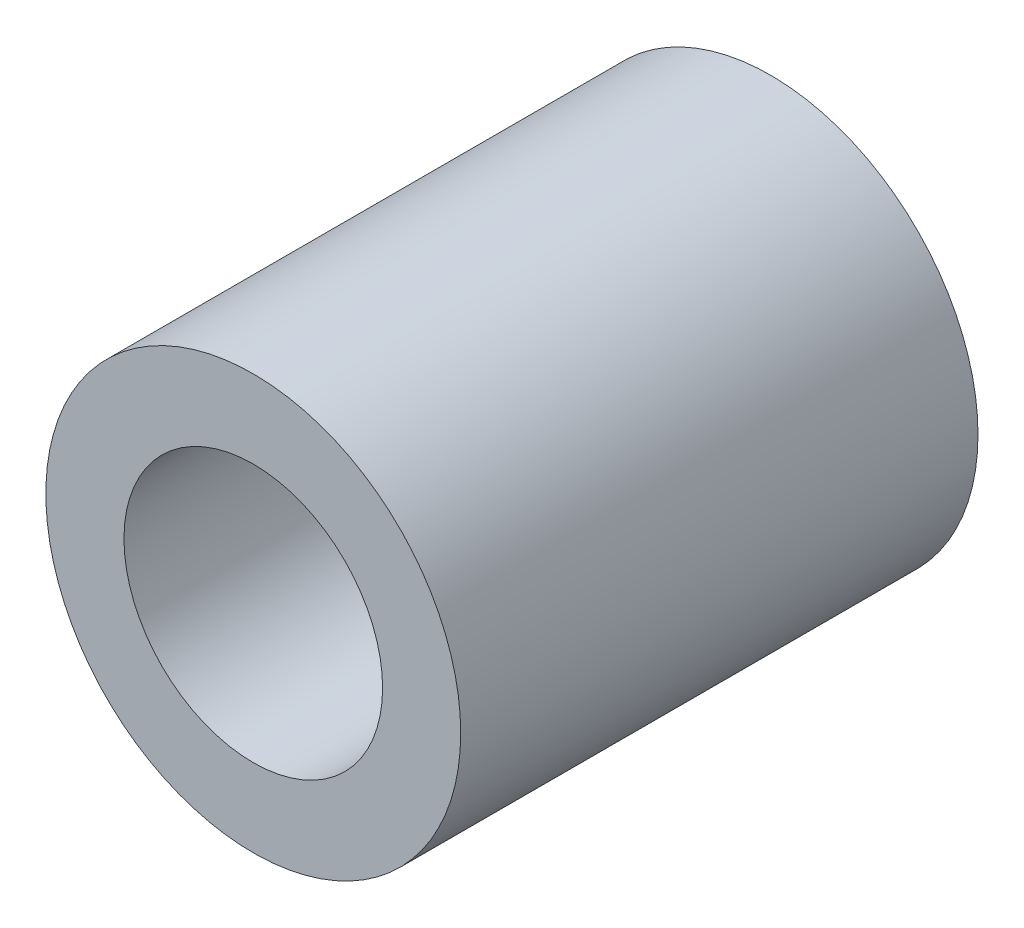
ISO-10303-21;
HEADER;
FILE_DESCRIPTION(('STEP AP214'),'2;1');
FILE_NAME('part.step','',(''),(''),'','','');
FILE_SCHEMA(('AUTOMOTIVE_DESIGN { 1 0 10303 214 1 1 1 1 }'));
ENDSEC;
DATA;
#1=APPLICATION_CONTEXT('core data for automotive mechanical design processes');
#2=APPLICATION_PROTOCOL_DEFINITION('international standard','automotive_design',2000,#1);
#3=PRODUCT_CONTEXT('',#1,'mechanical');
#4=PRODUCT('Part','Part','',(#3));
#5=PRODUCT_RELATED_PRODUCT_CATEGORY('part','',(#4));
#6=PRODUCT_DEFINITION_FORMATION('','',#4);
#7=PRODUCT_DEFINITION_CONTEXT('part definition',#1,'design');
#8=PRODUCT_DEFINITION('design','',#6,#7);
#9=PRODUCT_DEFINITION_SHAPE('','',#8);
#10=(LENGTH_UNIT() NAMED_UNIT(*) SI_UNIT(.MILLI.,.METRE.));
#11=(NAMED_UNIT(*) PLANE_ANGLE_UNIT() SI_UNIT($,.RADIAN.));
#12=(NAMED_UNIT(*) SI_UNIT($,.STERADIAN.) SOLID_ANGLE_UNIT());
#13=UNCERTAINTY_MEASURE_WITH_UNIT(LENGTH_MEASURE(1.E-05),#10,'distance_accuracy_value','');
#14=(GEOMETRIC_REPRESENTATION_CONTEXT(3) GLOBAL_UNCERTAINTY_ASSIGNED_CONTEXT((#13)) GLOBAL_UNIT_ASSIGNED_CONTEXT((#10,
#11,#12)) REPRESENTATION_CONTEXT('',''));
#15=CARTESIAN_POINT('',(0.,0.,0.));
#16=DIRECTION('',(0.,0.,1.));
#17=DIRECTION('',(1.,0.,0.));
#18=AXIS2_PLACEMENT_3D('',#15,#16,#17);
#19=CARTESIAN_POINT('',(0.,0.,5.));
#20=DIRECTION('',(0.,0.,1.));
#21=DIRECTION('',(1.,0.,0.));
#22=AXIS2_PLACEMENT_3D('',#19,#20,#21);
#23=PLANE('',#22);
#24=CARTESIAN_POINT('',(0.,0.,5.));
#25=DIRECTION('',(0.,0.,1.));
#26=DIRECTION('',(1.,0.,0.));
#27=AXIS2_PLACEMENT_3D('',#24,#25,#26);
#28=CIRCLE('',#27,4.01);
#29=CARTESIAN_POINT('',(4.01,0.,5.));
#30=VERTEX_POINT('',#29);
#31=EDGE_CURVE('E10',#30,#30,#28,.T.);
#32=ORIENTED_EDGE('',*,*,#31,.T.);
#33=EDGE_LOOP('',(#32));
#34=FACE_BOUND('',#33,.T.);
#35=CARTESIAN_POINT('',(0.,0.,5.));
#36=DIRECTION('',(0.,0.,1.));
#37=DIRECTION('',(1.,0.,0.));
#38=AXIS2_PLACEMENT_3D('',#35,#36,#37);
#39=CIRCLE('',#38,2.5);
#40=CARTESIAN_POINT('',(2.5,0.,5.));
#41=VERTEX_POINT('',#40);
#42=EDGE_CURVE('E44',#41,#41,#39,.T.);
#43=ORIENTED_EDGE('',*,*,#42,.F.);
#44=EDGE_LOOP('',(#43));
#45=FACE_BOUND('',#44,.T.);
#46=ADVANCED_FACE('F33',(#34,#45),#23,.T.);
#47=CARTESIAN_POINT('',(0.,0.,-5.));
#48=DIRECTION('',(0.,0.,1.));
#49=DIRECTION('',(1.,0.,0.));
#50=AXIS2_PLACEMENT_3D('',#47,#48,#49);
#51=PLANE('',#50);
#52=CARTESIAN_POINT('',(0.,0.,-5.));
#53=DIRECTION('',(0.,0.,1.));
#54=DIRECTION('',(1.,0.,0.));
#55=AXIS2_PLACEMENT_3D('',#52,#53,#54);
#56=CIRCLE('',#55,4.01);
#57=CARTESIAN_POINT('',(4.01,0.,-5.));
#58=VERTEX_POINT('',#57);
#59=EDGE_CURVE('E37',#58,#58,#56,.T.);
#60=ORIENTED_EDGE('',*,*,#59,.F.);
#61=EDGE_LOOP('',(#60));
#62=FACE_BOUND('',#61,.T.);
#63=CARTESIAN_POINT('',(0.,0.,-5.));
#64=DIRECTION('',(0.,0.,1.));
#65=DIRECTION('',(1.,0.,0.));
#66=AXIS2_PLACEMENT_3D('',#63,#64,#65);
#67=CIRCLE('',#66,2.5);
#68=CARTESIAN_POINT('',(2.5,0.,-5.));
#69=VERTEX_POINT('',#68);
#70=EDGE_CURVE('E46',#69,#69,#67,.T.);
#71=ORIENTED_EDGE('',*,*,#70,.T.);
#72=EDGE_LOOP('',(#71));
#73=FACE_BOUND('',#72,.T.);
#74=ADVANCED_FACE('F56',(#62,#73),#51,.F.);
#75=CARTESIAN_POINT('',(0.,0.,5.));
#76=DIRECTION('',(0.,0.,-1.));
#77=DIRECTION('',(-1.,0.,0.));
#78=AXIS2_PLACEMENT_3D('',#75,#76,#77);
#79=CYLINDRICAL_SURFACE('',#78,4.01);
#80=ORIENTED_EDGE('',*,*,#31,.F.);
#81=EDGE_LOOP('',(#80));
#82=FACE_BOUND('',#81,.T.);
#83=ORIENTED_EDGE('',*,*,#59,.T.);
#84=EDGE_LOOP('',(#83));
#85=FACE_BOUND('',#84,.T.);
#86=ADVANCED_FACE('F35',(#82,#85),#79,.T.);
#87=CARTESIAN_POINT('',(0.,0.,5.));
#88=DIRECTION('',(0.,0.,-1.));
#89=DIRECTION('',(-1.,0.,0.));
#90=AXIS2_PLACEMENT_3D('',#87,#88,#89);
#91=CYLINDRICAL_SURFACE('',#90,2.5);
#92=ORIENTED_EDGE('',*,*,#42,.T.);
#93=EDGE_LOOP('',(#92));
#94=FACE_BOUND('',#93,.T.);
#95=ORIENTED_EDGE('',*,*,#70,.F.);
#96=EDGE_LOOP('',(#95));
#97=FACE_BOUND('',#96,.T.);
#98=ADVANCED_FACE('F52',(#94,#97),#91,.F.);
#99=CLOSED_SHELL('',(#46,#74,#86,#98));
#100=MANIFOLD_SOLID_BREP('B2',#99);
#101=ADVANCED_BREP_SHAPE_REPRESENTATION('',(#18,#100),#14);
#102=SHAPE_DEFINITION_REPRESENTATION(#9,#101);
ENDSEC;
END-ISO-10303-21;
